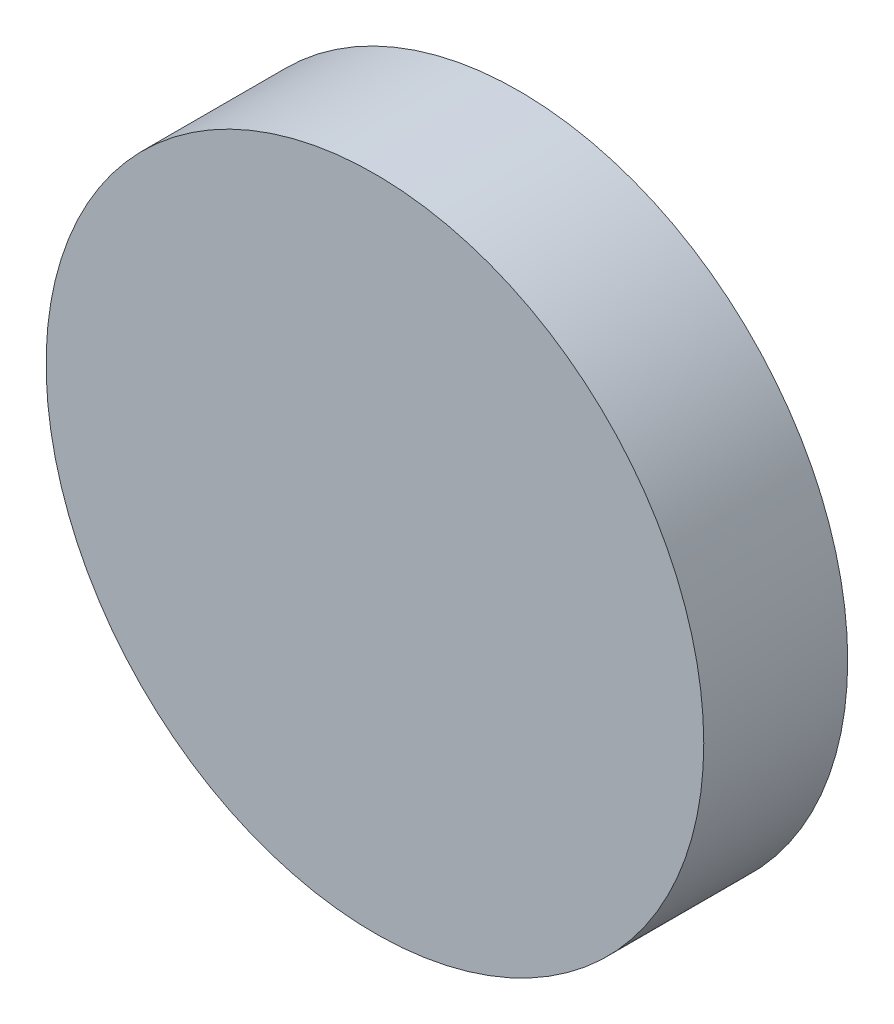
ISO-10303-21;
HEADER;
FILE_DESCRIPTION(('STEP AP214'),'2;1');
FILE_NAME('part.step','',(''),(''),'','','');
FILE_SCHEMA(('AUTOMOTIVE_DESIGN { 1 0 10303 214 1 1 1 1 }'));
ENDSEC;
DATA;
#1=APPLICATION_CONTEXT('core data for automotive mechanical design processes');
#2=APPLICATION_PROTOCOL_DEFINITION('international standard','automotive_design',2000,#1);
#3=PRODUCT_CONTEXT('',#1,'mechanical');
#4=PRODUCT('Part','Part','',(#3));
#5=PRODUCT_RELATED_PRODUCT_CATEGORY('part','',(#4));
#6=PRODUCT_DEFINITION_FORMATION('','',#4);
#7=PRODUCT_DEFINITION_CONTEXT('part definition',#1,'design');
#8=PRODUCT_DEFINITION('design','',#6,#7);
#9=PRODUCT_DEFINITION_SHAPE('','',#8);
#10=(LENGTH_UNIT() NAMED_UNIT(*) SI_UNIT(.MILLI.,.METRE.));
#11=(NAMED_UNIT(*) PLANE_ANGLE_UNIT() SI_UNIT($,.RADIAN.));
#12=(NAMED_UNIT(*) SI_UNIT($,.STERADIAN.) SOLID_ANGLE_UNIT());
#13=UNCERTAINTY_MEASURE_WITH_UNIT(LENGTH_MEASURE(1.E-05),#10,'distance_accuracy_value','');
#14=(GEOMETRIC_REPRESENTATION_CONTEXT(3) GLOBAL_UNCERTAINTY_ASSIGNED_CONTEXT((#13)) GLOBAL_UNIT_ASSIGNED_CONTEXT((#10,
#11,#12)) REPRESENTATION_CONTEXT('',''));
#15=CARTESIAN_POINT('',(0.,0.,0.));
#16=DIRECTION('',(0.,0.,1.));
#17=DIRECTION('',(1.,0.,0.));
#18=AXIS2_PLACEMENT_3D('',#15,#16,#17);
#19=CARTESIAN_POINT('',(0.,0.,100.));
#20=DIRECTION('',(0.,0.,-1.));
#21=DIRECTION('',(-1.,0.,0.));
#22=AXIS2_PLACEMENT_3D('',#19,#20,#21);
#23=CYLINDRICAL_SURFACE('',#22,150.);
#24=CARTESIAN_POINT('',(0.,0.,34.3397149198651));
#25=DIRECTION('',(0.,0.,-1.));
#26=DIRECTION('',(-1.,0.,0.));
#27=AXIS2_PLACEMENT_3D('',#24,#25,#26);
#28=CIRCLE('',#27,150.);
#29=CARTESIAN_POINT('',(150.,0.,34.3397149198651));
#30=VERTEX_POINT('',#29);
#31=EDGE_CURVE('E34',#30,#30,#28,.F.);
#32=ORIENTED_EDGE('',*,*,#31,.T.);
#33=EDGE_LOOP('',(#32));
#34=FACE_BOUND('',#33,.T.);
#35=CARTESIAN_POINT('',(0.,0.,100.));
#36=DIRECTION('',(0.,0.,1.));
#37=DIRECTION('',(1.,0.,0.));
#38=AXIS2_PLACEMENT_3D('',#35,#36,#37);
#39=CIRCLE('',#38,150.);
#40=CARTESIAN_POINT('',(150.,0.,100.));
#41=VERTEX_POINT('',#40);
#42=EDGE_CURVE('E10',#41,#41,#39,.T.);
#43=ORIENTED_EDGE('',*,*,#42,.F.);
#44=EDGE_LOOP('',(#43));
#45=FACE_BOUND('',#44,.T.);
#46=ADVANCED_FACE('F31',(#34,#45),#23,.T.);
#47=CARTESIAN_POINT('',(0.,0.,100.));
#48=DIRECTION('',(0.,0.,1.));
#49=DIRECTION('',(1.,0.,0.));
#50=AXIS2_PLACEMENT_3D('',#47,#48,#49);
#51=PLANE('',#50);
#52=ORIENTED_EDGE('',*,*,#42,.T.);
#53=EDGE_LOOP('',(#52));
#54=FACE_BOUND('',#53,.T.);
#55=ADVANCED_FACE('F55',(#54),#51,.T.);
#56=CARTESIAN_POINT('',(0.,0.,90.));
#57=DIRECTION('',(0.,0.,-1.));
#58=DIRECTION('',(1.,0.,0.));
#59=AXIS2_PLACEMENT_3D('',#56,#57,#58);
#60=CONICAL_SURFACE('',#59,5.,1.20427718387609);
#61=CARTESIAN_POINT('',(0.,0.,90.));
#62=DIRECTION('',(0.,0.,1.));
#63=DIRECTION('',(1.,0.,0.));
#64=AXIS2_PLACEMENT_3D('',#61,#62,#63);
#65=CIRCLE('',#64,5.);
#66=CARTESIAN_POINT('',(5.00000000000002,0.,90.));
#67=VERTEX_POINT('',#66);
#68=EDGE_CURVE('E41',#67,#67,#65,.T.);
#69=CARTESIAN_POINT('',(5.00000000000002,0.,90.));
#70=CARTESIAN_POINT('',(6.51041666666668,0.,89.4202053637486));
#71=CARTESIAN_POINT('',(8.02083333333335,0.,88.8404107274972));
#72=CARTESIAN_POINT('',(11.0416666666667,0.,87.6808214549944));
#73=CARTESIAN_POINT('',(12.5520833333334,0.,87.101026818743));
#74=CARTESIAN_POINT('',(15.5729166666667,0.,85.9414375462402));
#75=CARTESIAN_POINT('',(17.0833333333333,0.,85.3616429099887));
#76=CARTESIAN_POINT('',(20.1041666666667,0.,84.2020536374859));
#77=CARTESIAN_POINT('',(21.6145833333334,0.,83.6222590012345));
#78=CARTESIAN_POINT('',(24.6354166666667,0.,82.4626697287317));
#79=CARTESIAN_POINT('',(26.1458333333333,0.,81.8828750924803));
#80=CARTESIAN_POINT('',(29.1666666666667,0.,80.7232858199775));
#81=CARTESIAN_POINT('',(30.6770833333333,0.,80.1434911837261));
#82=CARTESIAN_POINT('',(33.6979166666667,0.,78.9839019112233));
#83=CARTESIAN_POINT('',(35.2083333333333,0.,78.4041072749719));
#84=CARTESIAN_POINT('',(38.2291666666667,0.,77.2445180024691));
#85=CARTESIAN_POINT('',(39.7395833333333,0.,76.6647233662177));
#86=CARTESIAN_POINT('',(42.7604166666667,0.,75.5051340937149));
#87=CARTESIAN_POINT('',(44.2708333333333,0.,74.9253394574635));
#88=CARTESIAN_POINT('',(47.2916666666667,0.,73.7657501849607));
#89=CARTESIAN_POINT('',(48.8020833333333,0.,73.1859555487093));
#90=CARTESIAN_POINT('',(51.8229166666667,0.,72.0263662762064));
#91=CARTESIAN_POINT('',(53.3333333333333,0.,71.446571639955));
#92=CARTESIAN_POINT('',(56.3541666666667,0.,70.2869823674522));
#93=CARTESIAN_POINT('',(57.8645833333333,0.,69.7071877312008));
#94=CARTESIAN_POINT('',(60.8854166666667,0.,68.547598458698));
#95=CARTESIAN_POINT('',(62.3958333333334,0.,67.9678038224466));
#96=CARTESIAN_POINT('',(65.4166666666667,0.,66.8082145499438));
#97=CARTESIAN_POINT('',(66.9270833333334,0.,66.2284199136924));
#98=CARTESIAN_POINT('',(69.9479166666667,0.,65.0688306411896));
#99=CARTESIAN_POINT('',(71.4583333333334,0.,64.4890360049382));
#100=CARTESIAN_POINT('',(74.4791666666667,0.,63.3294467324354));
#101=CARTESIAN_POINT('',(75.9895833333334,0.,62.749652096184));
#102=CARTESIAN_POINT('',(79.0104166666667,0.,61.5900628236812));
#103=CARTESIAN_POINT('',(80.5208333333334,0.,61.0102681874297));
#104=CARTESIAN_POINT('',(83.5416666666667,0.,59.8506789149269));
#105=CARTESIAN_POINT('',(85.0520833333333,0.,59.2708842786755));
#106=CARTESIAN_POINT('',(88.0729166666667,0.,58.1112950061727));
#107=CARTESIAN_POINT('',(89.5833333333333,0.,57.5315003699213));
#108=CARTESIAN_POINT('',(92.6041666666667,0.,56.3719110974185));
#109=CARTESIAN_POINT('',(94.1145833333333,0.,55.7921164611671));
#110=CARTESIAN_POINT('',(97.1354166666667,0.,54.6325271886643));
#111=CARTESIAN_POINT('',(98.6458333333333,0.,54.0527325524129));
#112=CARTESIAN_POINT('',(101.666666666667,0.,52.8931432799101));
#113=CARTESIAN_POINT('',(103.177083333333,0.,52.3133486436587));
#114=CARTESIAN_POINT('',(106.197916666667,0.,51.1537593711559));
#115=CARTESIAN_POINT('',(107.708333333333,0.,50.5739647349045));
#116=CARTESIAN_POINT('',(110.729166666667,0.,49.4143754624017));
#117=CARTESIAN_POINT('',(112.239583333333,0.,48.8345808261503));
#118=CARTESIAN_POINT('',(115.260416666667,0.,47.6749915536474));
#119=CARTESIAN_POINT('',(116.770833333333,0.,47.095196917396));
#120=CARTESIAN_POINT('',(119.791666666667,0.,45.9356076448932));
#121=CARTESIAN_POINT('',(121.302083333333,0.,45.3558130086418));
#122=CARTESIAN_POINT('',(124.322916666667,0.,44.196223736139));
#123=CARTESIAN_POINT('',(125.833333333333,0.,43.6164290998876));
#124=CARTESIAN_POINT('',(128.854166666667,0.,42.4568398273848));
#125=CARTESIAN_POINT('',(130.364583333333,0.,41.8770451911334));
#126=CARTESIAN_POINT('',(133.385416666667,0.,40.7174559186306));
#127=CARTESIAN_POINT('',(134.895833333333,0.,40.1376612823792));
#128=CARTESIAN_POINT('',(137.916666666667,0.,38.9780720098764));
#129=CARTESIAN_POINT('',(139.427083333333,0.,38.3982773736249));
#130=CARTESIAN_POINT('',(142.447916666667,0.,37.2386881011221));
#131=CARTESIAN_POINT('',(143.958333333333,0.,36.6588934648707));
#132=CARTESIAN_POINT('',(146.979166666667,0.,35.4993041923679));
#133=CARTESIAN_POINT('',(148.489583333333,0.,34.9195095561165));
#134=CARTESIAN_POINT('',(150.,0.,34.3397149198651));
#135=B_SPLINE_CURVE_WITH_KNOTS('',3,(#69,#70,#71,#72,#73,#74,#75,#76,#77,#78,#79,#80,#81,#82,
#83,#84,#85,#86,#87,#88,#89,#90,#91,#92,#93,#94,#95,#96,#97,#98,#99,#100,#101,#102,#103,#104,
#105,#106,#107,#108,#109,#110,#111,#112,#113,#114,#115,#116,#117,#118,#119,#120,#121,#122,#123,
#124,#125,#126,#127,#128,#129,#130,#131,#132,#133,#134),.UNSPECIFIED.,.F.,.F.,(4,2,2,2,2,2,2,2,
2,2,2,2,2,2,2,2,2,2,2,2,2,2,2,2,2,2,2,2,2,2,2,2,4),(0.,4.85362575241779,9.70725150483557,
14.5608772572534,19.4145030096711,24.2681287620889,29.1217545145067,33.9753802669245,
38.8290060193423,43.6826317717601,48.5362575241778,53.3898832765956,58.2435090290134,
63.0971347814312,67.950760533849,72.8043862862668,77.6580120386845,82.5116377911023,
87.3652635435201,92.2188892959379,97.0725150483557,101.926140800773,106.779766553191,
111.633392305609,116.487018058027,121.340643810445,126.194269562862,131.04789531528,
135.901521067698,140.755146820116,145.608772572533,150.462398324951,155.316024077369),.UNSPECIFIED.);
#136=EDGE_CURVE('BSEAM46',#67,#30,#135,.T.);
#137=ORIENTED_EDGE('',*,*,#68,.T.);
#138=ORIENTED_EDGE('',*,*,#31,.F.);
#139=ORIENTED_EDGE('',*,*,#136,.T.);
#140=ORIENTED_EDGE('',*,*,#136,.F.);
#141=EDGE_LOOP('',(#137,#139,#138,#140));
#142=FACE_BOUND('',#141,.T.);
#143=ADVANCED_FACE('F46',(#142),#60,.F.);
#144=CARTESIAN_POINT('',(0.,0.,90.));
#145=DIRECTION('',(0.,0.,1.));
#146=DIRECTION('',(1.,0.,0.));
#147=AXIS2_PLACEMENT_3D('',#144,#145,#146);
#148=PLANE('',#147);
#149=ORIENTED_EDGE('',*,*,#68,.F.);
#150=EDGE_LOOP('',(#149));
#151=FACE_BOUND('',#150,.T.);
#152=ADVANCED_FACE('F49',(#151),#148,.F.);
#153=CLOSED_SHELL('',(#46,#55,#143,#152));
#154=MANIFOLD_SOLID_BREP('B2',#153);
#155=ADVANCED_BREP_SHAPE_REPRESENTATION('',(#18,#154),#14);
#156=SHAPE_DEFINITION_REPRESENTATION(#9,#155);
ENDSEC;
END-ISO-10303-21;
